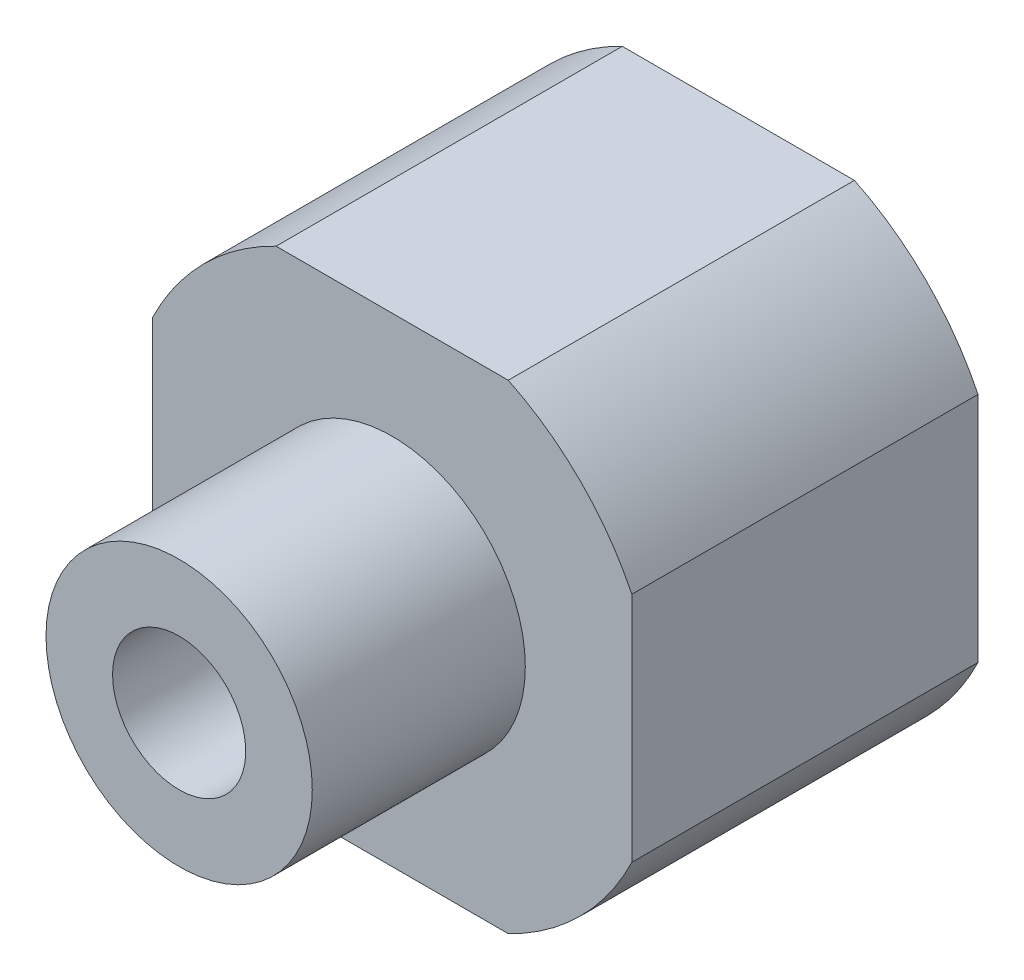
ISO-10303-21;
HEADER;
FILE_DESCRIPTION(('STEP AP214'),'2;1');
FILE_NAME('part.step','',(''),(''),'','','');
FILE_SCHEMA(('AUTOMOTIVE_DESIGN { 1 0 10303 214 1 1 1 1 }'));
ENDSEC;
DATA;
#1=APPLICATION_CONTEXT('core data for automotive mechanical design processes');
#2=APPLICATION_PROTOCOL_DEFINITION('international standard','automotive_design',2000,#1);
#3=PRODUCT_CONTEXT('',#1,'mechanical');
#4=PRODUCT('Part','Part','',(#3));
#5=PRODUCT_RELATED_PRODUCT_CATEGORY('part','',(#4));
#6=PRODUCT_DEFINITION_FORMATION('','',#4);
#7=PRODUCT_DEFINITION_CONTEXT('part definition',#1,'design');
#8=PRODUCT_DEFINITION('design','',#6,#7);
#9=PRODUCT_DEFINITION_SHAPE('','',#8);
#10=(LENGTH_UNIT() NAMED_UNIT(*) SI_UNIT(.MILLI.,.METRE.));
#11=(NAMED_UNIT(*) PLANE_ANGLE_UNIT() SI_UNIT($,.RADIAN.));
#12=(NAMED_UNIT(*) SI_UNIT($,.STERADIAN.) SOLID_ANGLE_UNIT());
#13=UNCERTAINTY_MEASURE_WITH_UNIT(LENGTH_MEASURE(1.E-05),#10,'distance_accuracy_value','');
#14=(GEOMETRIC_REPRESENTATION_CONTEXT(3) GLOBAL_UNCERTAINTY_ASSIGNED_CONTEXT((#13)) GLOBAL_UNIT_ASSIGNED_CONTEXT((#10,
#11,#12)) REPRESENTATION_CONTEXT('',''));
#15=CARTESIAN_POINT('',(0.,0.,0.));
#16=DIRECTION('',(0.,0.,1.));
#17=DIRECTION('',(1.,0.,0.));
#18=AXIS2_PLACEMENT_3D('',#15,#16,#17);
#19=CARTESIAN_POINT('',(0.,0.,13.));
#20=DIRECTION('',(0.,0.,-1.));
#21=DIRECTION('',(-1.,0.,0.));
#22=AXIS2_PLACEMENT_3D('',#19,#20,#21);
#23=CYLINDRICAL_SURFACE('',#22,10.);
#24=CARTESIAN_POINT('',(0.,0.,0.));
#25=DIRECTION('',(0.,0.,1.));
#26=DIRECTION('',(1.,0.,0.));
#27=AXIS2_PLACEMENT_3D('',#24,#25,#26);
#28=CIRCLE('',#27,10.);
#29=CARTESIAN_POINT('',(9.,4.35889894354068,0.));
#30=VERTEX_POINT('',#29);
#31=CARTESIAN_POINT('',(4.35889894354067,9.,0.));
#32=VERTEX_POINT('',#31);
#33=EDGE_CURVE('E128',#30,#32,#28,.T.);
#34=ORIENTED_EDGE('',*,*,#33,.T.);
#35=DIRECTION('',(0.,0.,-1.));
#36=VECTOR('',#35,1.);
#37=CARTESIAN_POINT('',(4.35889894354067,9.,13.));
#38=LINE('',#37,#36);
#39=CARTESIAN_POINT('',(4.35889894354067,9.,13.));
#40=VERTEX_POINT('',#39);
#41=EDGE_CURVE('E11',#40,#32,#38,.T.);
#42=ORIENTED_EDGE('',*,*,#41,.F.);
#43=CARTESIAN_POINT('',(0.,0.,13.));
#44=DIRECTION('',(0.,0.,1.));
#45=DIRECTION('',(1.,0.,0.));
#46=AXIS2_PLACEMENT_3D('',#43,#44,#45);
#47=CIRCLE('',#46,10.);
#48=CARTESIAN_POINT('',(9.,4.35889894354068,13.));
#49=VERTEX_POINT('',#48);
#50=EDGE_CURVE('E143',#49,#40,#47,.T.);
#51=ORIENTED_EDGE('',*,*,#50,.F.);
#52=DIRECTION('',(0.,0.,-1.));
#53=VECTOR('',#52,1.);
#54=CARTESIAN_POINT('',(9.,4.35889894354068,13.));
#55=LINE('',#54,#53);
#56=EDGE_CURVE('E124',#49,#30,#55,.T.);
#57=ORIENTED_EDGE('',*,*,#56,.T.);
#58=EDGE_LOOP('',(#34,#42,#51,#57));
#59=FACE_BOUND('',#58,.T.);
#60=ADVANCED_FACE('F32',(#59),#23,.T.);
#61=CARTESIAN_POINT('',(-4.35889894354067,9.,13.));
#62=DIRECTION('',(0.,-1.,0.));
#63=DIRECTION('',(0.,0.,-1.));
#64=AXIS2_PLACEMENT_3D('',#61,#62,#63);
#65=PLANE('',#64);
#66=DIRECTION('',(-1.,0.,0.));
#67=VECTOR('',#66,1.);
#68=CARTESIAN_POINT('',(-4.35889894354067,9.,0.));
#69=LINE('',#68,#67);
#70=CARTESIAN_POINT('',(-4.35889894354067,9.,0.));
#71=VERTEX_POINT('',#70);
#72=EDGE_CURVE('E131',#32,#71,#69,.T.);
#73=ORIENTED_EDGE('',*,*,#72,.T.);
#74=DIRECTION('',(0.,0.,-1.));
#75=VECTOR('',#74,1.);
#76=CARTESIAN_POINT('',(-4.35889894354067,9.,13.));
#77=LINE('',#76,#75);
#78=CARTESIAN_POINT('',(-4.35889894354067,9.,13.));
#79=VERTEX_POINT('',#78);
#80=EDGE_CURVE('E40',#79,#71,#77,.T.);
#81=ORIENTED_EDGE('',*,*,#80,.F.);
#82=DIRECTION('',(-1.,0.,0.));
#83=VECTOR('',#82,1.);
#84=CARTESIAN_POINT('',(-4.35889894354067,9.,13.));
#85=LINE('',#84,#83);
#86=EDGE_CURVE('E91',#40,#79,#85,.T.);
#87=ORIENTED_EDGE('',*,*,#86,.F.);
#88=ORIENTED_EDGE('',*,*,#41,.T.);
#89=EDGE_LOOP('',(#73,#81,#87,#88));
#90=FACE_BOUND('',#89,.T.);
#91=ADVANCED_FACE('F209',(#90),#65,.F.);
#92=CARTESIAN_POINT('',(0.,0.,13.));
#93=DIRECTION('',(0.,0.,-1.));
#94=DIRECTION('',(-1.,0.,0.));
#95=AXIS2_PLACEMENT_3D('',#92,#93,#94);
#96=CYLINDRICAL_SURFACE('',#95,10.);
#97=CARTESIAN_POINT('',(0.,0.,0.));
#98=DIRECTION('',(0.,0.,1.));
#99=DIRECTION('',(1.,0.,0.));
#100=AXIS2_PLACEMENT_3D('',#97,#98,#99);
#101=CIRCLE('',#100,10.);
#102=CARTESIAN_POINT('',(-9.,4.35889894354067,0.));
#103=VERTEX_POINT('',#102);
#104=EDGE_CURVE('E134',#71,#103,#101,.T.);
#105=ORIENTED_EDGE('',*,*,#104,.T.);
#106=DIRECTION('',(0.,0.,-1.));
#107=VECTOR('',#106,1.);
#108=CARTESIAN_POINT('',(-9.,4.35889894354067,13.));
#109=LINE('',#108,#107);
#110=CARTESIAN_POINT('',(-9.,4.35889894354067,13.));
#111=VERTEX_POINT('',#110);
#112=EDGE_CURVE('E150',#111,#103,#109,.T.);
#113=ORIENTED_EDGE('',*,*,#112,.F.);
#114=CARTESIAN_POINT('',(0.,0.,13.));
#115=DIRECTION('',(0.,0.,1.));
#116=DIRECTION('',(1.,0.,0.));
#117=AXIS2_PLACEMENT_3D('',#114,#115,#116);
#118=CIRCLE('',#117,10.);
#119=EDGE_CURVE('E158',#79,#111,#118,.T.);
#120=ORIENTED_EDGE('',*,*,#119,.F.);
#121=ORIENTED_EDGE('',*,*,#80,.T.);
#122=EDGE_LOOP('',(#105,#113,#120,#121));
#123=FACE_BOUND('',#122,.T.);
#124=ADVANCED_FACE('F156',(#123),#96,.T.);
#125=CARTESIAN_POINT('',(-9.,4.35889894354067,13.));
#126=DIRECTION('',(1.,0.,0.));
#127=DIRECTION('',(0.,0.,-1.));
#128=AXIS2_PLACEMENT_3D('',#125,#126,#127);
#129=PLANE('',#128);
#130=DIRECTION('',(0.,-1.,0.));
#131=VECTOR('',#130,1.);
#132=CARTESIAN_POINT('',(-9.,4.35889894354067,0.));
#133=LINE('',#132,#131);
#134=CARTESIAN_POINT('',(-9.,-4.35889894354067,0.));
#135=VERTEX_POINT('',#134);
#136=EDGE_CURVE('E136',#103,#135,#133,.T.);
#137=ORIENTED_EDGE('',*,*,#136,.T.);
#138=DIRECTION('',(0.,0.,-1.));
#139=VECTOR('',#138,1.);
#140=CARTESIAN_POINT('',(-9.,-4.35889894354067,13.));
#141=LINE('',#140,#139);
#142=CARTESIAN_POINT('',(-9.,-4.35889894354067,13.));
#143=VERTEX_POINT('',#142);
#144=EDGE_CURVE('E147',#143,#135,#141,.T.);
#145=ORIENTED_EDGE('',*,*,#144,.F.);
#146=DIRECTION('',(0.,-1.,0.));
#147=VECTOR('',#146,1.);
#148=CARTESIAN_POINT('',(-9.,4.35889894354067,13.));
#149=LINE('',#148,#147);
#150=EDGE_CURVE('E170',#111,#143,#149,.T.);
#151=ORIENTED_EDGE('',*,*,#150,.F.);
#152=ORIENTED_EDGE('',*,*,#112,.T.);
#153=EDGE_LOOP('',(#137,#145,#151,#152));
#154=FACE_BOUND('',#153,.T.);
#155=ADVANCED_FACE('F166',(#154),#129,.F.);
#156=CARTESIAN_POINT('',(0.,0.,13.));
#157=DIRECTION('',(0.,0.,-1.));
#158=DIRECTION('',(-1.,0.,0.));
#159=AXIS2_PLACEMENT_3D('',#156,#157,#158);
#160=CYLINDRICAL_SURFACE('',#159,10.);
#161=CARTESIAN_POINT('',(0.,0.,0.));
#162=DIRECTION('',(0.,0.,1.));
#163=DIRECTION('',(1.,0.,0.));
#164=AXIS2_PLACEMENT_3D('',#161,#162,#163);
#165=CIRCLE('',#164,10.);
#166=CARTESIAN_POINT('',(-4.35889894354068,-9.,0.));
#167=VERTEX_POINT('',#166);
#168=EDGE_CURVE('E138',#135,#167,#165,.T.);
#169=ORIENTED_EDGE('',*,*,#168,.T.);
#170=DIRECTION('',(0.,0.,-1.));
#171=VECTOR('',#170,1.);
#172=CARTESIAN_POINT('',(-4.35889894354068,-9.,13.));
#173=LINE('',#172,#171);
#174=CARTESIAN_POINT('',(-4.35889894354068,-9.,13.));
#175=VERTEX_POINT('',#174);
#176=EDGE_CURVE('E119',#175,#167,#173,.T.);
#177=ORIENTED_EDGE('',*,*,#176,.F.);
#178=CARTESIAN_POINT('',(0.,0.,13.));
#179=DIRECTION('',(0.,0.,1.));
#180=DIRECTION('',(1.,0.,0.));
#181=AXIS2_PLACEMENT_3D('',#178,#179,#180);
#182=CIRCLE('',#181,10.);
#183=EDGE_CURVE('E110',#143,#175,#182,.T.);
#184=ORIENTED_EDGE('',*,*,#183,.F.);
#185=ORIENTED_EDGE('',*,*,#144,.T.);
#186=EDGE_LOOP('',(#169,#177,#184,#185));
#187=FACE_BOUND('',#186,.T.);
#188=ADVANCED_FACE('F169',(#187),#160,.T.);
#189=CARTESIAN_POINT('',(-4.35889894354068,-9.,13.));
#190=DIRECTION('',(0.,1.,0.));
#191=DIRECTION('',(0.,0.,1.));
#192=AXIS2_PLACEMENT_3D('',#189,#190,#191);
#193=PLANE('',#192);
#194=DIRECTION('',(1.,0.,0.));
#195=VECTOR('',#194,1.);
#196=CARTESIAN_POINT('',(-4.35889894354068,-9.,0.));
#197=LINE('',#196,#195);
#198=CARTESIAN_POINT('',(4.35889894354068,-9.,0.));
#199=VERTEX_POINT('',#198);
#200=EDGE_CURVE('E118',#167,#199,#197,.T.);
#201=ORIENTED_EDGE('',*,*,#200,.T.);
#202=DIRECTION('',(0.,0.,-1.));
#203=VECTOR('',#202,1.);
#204=CARTESIAN_POINT('',(4.35889894354068,-9.,13.));
#205=LINE('',#204,#203);
#206=CARTESIAN_POINT('',(4.35889894354068,-9.,13.));
#207=VERTEX_POINT('',#206);
#208=EDGE_CURVE('E115',#207,#199,#205,.T.);
#209=ORIENTED_EDGE('',*,*,#208,.F.);
#210=DIRECTION('',(1.,0.,0.));
#211=VECTOR('',#210,1.);
#212=CARTESIAN_POINT('',(-4.35889894354068,-9.,13.));
#213=LINE('',#212,#211);
#214=EDGE_CURVE('E104',#175,#207,#213,.T.);
#215=ORIENTED_EDGE('',*,*,#214,.F.);
#216=ORIENTED_EDGE('',*,*,#176,.T.);
#217=EDGE_LOOP('',(#201,#209,#215,#216));
#218=FACE_BOUND('',#217,.T.);
#219=ADVANCED_FACE('F116',(#218),#193,.F.);
#220=CARTESIAN_POINT('',(0.,0.,13.));
#221=DIRECTION('',(0.,0.,-1.));
#222=DIRECTION('',(-1.,0.,0.));
#223=AXIS2_PLACEMENT_3D('',#220,#221,#222);
#224=CYLINDRICAL_SURFACE('',#223,10.);
#225=CARTESIAN_POINT('',(0.,0.,0.));
#226=DIRECTION('',(0.,0.,1.));
#227=DIRECTION('',(1.,0.,0.));
#228=AXIS2_PLACEMENT_3D('',#225,#226,#227);
#229=CIRCLE('',#228,10.);
#230=CARTESIAN_POINT('',(9.,-4.35889894354068,0.));
#231=VERTEX_POINT('',#230);
#232=EDGE_CURVE('E77',#199,#231,#229,.T.);
#233=ORIENTED_EDGE('',*,*,#232,.T.);
#234=DIRECTION('',(0.,0.,-1.));
#235=VECTOR('',#234,1.);
#236=CARTESIAN_POINT('',(9.,-4.35889894354068,13.));
#237=LINE('',#236,#235);
#238=CARTESIAN_POINT('',(9.,-4.35889894354068,13.));
#239=VERTEX_POINT('',#238);
#240=EDGE_CURVE('E120',#239,#231,#237,.T.);
#241=ORIENTED_EDGE('',*,*,#240,.F.);
#242=CARTESIAN_POINT('',(0.,0.,13.));
#243=DIRECTION('',(0.,0.,1.));
#244=DIRECTION('',(1.,0.,0.));
#245=AXIS2_PLACEMENT_3D('',#242,#243,#244);
#246=CIRCLE('',#245,10.);
#247=EDGE_CURVE('E108',#207,#239,#246,.T.);
#248=ORIENTED_EDGE('',*,*,#247,.F.);
#249=ORIENTED_EDGE('',*,*,#208,.T.);
#250=EDGE_LOOP('',(#233,#241,#248,#249));
#251=FACE_BOUND('',#250,.T.);
#252=ADVANCED_FACE('F122',(#251),#224,.T.);
#253=CARTESIAN_POINT('',(9.,4.35889894354068,13.));
#254=DIRECTION('',(-1.,0.,0.));
#255=DIRECTION('',(0.,0.,1.));
#256=AXIS2_PLACEMENT_3D('',#253,#254,#255);
#257=PLANE('',#256);
#258=DIRECTION('',(0.,1.,0.));
#259=VECTOR('',#258,1.);
#260=CARTESIAN_POINT('',(9.,4.35889894354068,0.));
#261=LINE('',#260,#259);
#262=EDGE_CURVE('E83',#231,#30,#261,.T.);
#263=ORIENTED_EDGE('',*,*,#262,.T.);
#264=ORIENTED_EDGE('',*,*,#56,.F.);
#265=DIRECTION('',(0.,1.,0.));
#266=VECTOR('',#265,1.);
#267=CARTESIAN_POINT('',(9.,4.35889894354068,13.));
#268=LINE('',#267,#266);
#269=EDGE_CURVE('E48',#239,#49,#268,.T.);
#270=ORIENTED_EDGE('',*,*,#269,.F.);
#271=ORIENTED_EDGE('',*,*,#240,.T.);
#272=EDGE_LOOP('',(#263,#264,#270,#271));
#273=FACE_BOUND('',#272,.T.);
#274=ADVANCED_FACE('F216',(#273),#257,.F.);
#275=CARTESIAN_POINT('',(0.,0.,13.));
#276=DIRECTION('',(0.,0.,1.));
#277=DIRECTION('',(1.,0.,0.));
#278=AXIS2_PLACEMENT_3D('',#275,#276,#277);
#279=PLANE('',#278);
#280=CARTESIAN_POINT('',(0.,0.,13.));
#281=DIRECTION('',(0.,0.,1.));
#282=DIRECTION('',(1.,0.,0.));
#283=AXIS2_PLACEMENT_3D('',#280,#281,#282);
#284=CIRCLE('',#283,5.);
#285=CARTESIAN_POINT('',(-5.,0.,13.));
#286=VERTEX_POINT('',#285);
#287=EDGE_CURVE('E132',#286,#286,#284,.F.);
#288=ORIENTED_EDGE('',*,*,#287,.T.);
#289=EDGE_LOOP('',(#288));
#290=FACE_BOUND('',#289,.T.);
#291=ORIENTED_EDGE('',*,*,#50,.T.);
#292=ORIENTED_EDGE('',*,*,#86,.T.);
#293=ORIENTED_EDGE('',*,*,#119,.T.);
#294=ORIENTED_EDGE('',*,*,#150,.T.);
#295=ORIENTED_EDGE('',*,*,#183,.T.);
#296=ORIENTED_EDGE('',*,*,#214,.T.);
#297=ORIENTED_EDGE('',*,*,#247,.T.);
#298=ORIENTED_EDGE('',*,*,#269,.T.);
#299=EDGE_LOOP('',(#291,#292,#293,#294,#295,#296,#297,#298));
#300=FACE_BOUND('',#299,.T.);
#301=ADVANCED_FACE('F106',(#290,#300),#279,.T.);
#302=CARTESIAN_POINT('',(0.,0.,0.));
#303=DIRECTION('',(0.,0.,1.));
#304=DIRECTION('',(1.,0.,0.));
#305=AXIS2_PLACEMENT_3D('',#302,#303,#304);
#306=PLANE('',#305);
#307=CARTESIAN_POINT('',(0.,0.,0.));
#308=DIRECTION('',(0.,0.,1.));
#309=DIRECTION('',(1.,0.,0.));
#310=AXIS2_PLACEMENT_3D('',#307,#308,#309);
#311=CIRCLE('',#310,2.5);
#312=CARTESIAN_POINT('',(-2.5,0.,0.));
#313=VERTEX_POINT('',#312);
#314=EDGE_CURVE('E182',#313,#313,#311,.T.);
#315=ORIENTED_EDGE('',*,*,#314,.T.);
#316=EDGE_LOOP('',(#315));
#317=FACE_BOUND('',#316,.T.);
#318=ORIENTED_EDGE('',*,*,#33,.F.);
#319=ORIENTED_EDGE('',*,*,#262,.F.);
#320=ORIENTED_EDGE('',*,*,#232,.F.);
#321=ORIENTED_EDGE('',*,*,#200,.F.);
#322=ORIENTED_EDGE('',*,*,#168,.F.);
#323=ORIENTED_EDGE('',*,*,#136,.F.);
#324=ORIENTED_EDGE('',*,*,#104,.F.);
#325=ORIENTED_EDGE('',*,*,#72,.F.);
#326=EDGE_LOOP('',(#318,#319,#320,#321,#322,#323,#324,#325));
#327=FACE_BOUND('',#326,.T.);
#328=ADVANCED_FACE('F162',(#317,#327),#306,.F.);
#329=CARTESIAN_POINT('',(0.,0.,21.));
#330=DIRECTION('',(0.,0.,-1.));
#331=DIRECTION('',(-1.,0.,0.));
#332=AXIS2_PLACEMENT_3D('',#329,#330,#331);
#333=CYLINDRICAL_SURFACE('',#332,5.);
#334=CARTESIAN_POINT('',(0.,0.,21.));
#335=DIRECTION('',(0.,0.,1.));
#336=DIRECTION('',(1.,0.,0.));
#337=AXIS2_PLACEMENT_3D('',#334,#335,#336);
#338=CIRCLE('',#337,5.);
#339=CARTESIAN_POINT('',(-5.,0.,21.));
#340=VERTEX_POINT('',#339);
#341=EDGE_CURVE('E178',#340,#340,#338,.T.);
#342=CARTESIAN_POINT('',(-5.,0.,13.));
#343=CARTESIAN_POINT('',(-5.,0.,13.0833333333333));
#344=CARTESIAN_POINT('',(-5.,0.,13.1666666666667));
#345=CARTESIAN_POINT('',(-5.,0.,13.3333333333333));
#346=CARTESIAN_POINT('',(-5.,0.,13.4166666666667));
#347=CARTESIAN_POINT('',(-5.,0.,13.5833333333333));
#348=CARTESIAN_POINT('',(-5.,0.,13.6666666666667));
#349=CARTESIAN_POINT('',(-5.,0.,13.8333333333333));
#350=CARTESIAN_POINT('',(-5.,0.,13.9166666666667));
#351=CARTESIAN_POINT('',(-5.,0.,14.0833333333333));
#352=CARTESIAN_POINT('',(-5.,0.,14.1666666666667));
#353=CARTESIAN_POINT('',(-5.,0.,14.3333333333333));
#354=CARTESIAN_POINT('',(-5.,0.,14.4166666666667));
#355=CARTESIAN_POINT('',(-5.,0.,14.5833333333333));
#356=CARTESIAN_POINT('',(-5.,0.,14.6666666666667));
#357=CARTESIAN_POINT('',(-5.,0.,14.8333333333333));
#358=CARTESIAN_POINT('',(-5.,0.,14.9166666666667));
#359=CARTESIAN_POINT('',(-5.,0.,15.0833333333333));
#360=CARTESIAN_POINT('',(-5.,0.,15.1666666666667));
#361=CARTESIAN_POINT('',(-5.,0.,15.3333333333333));
#362=CARTESIAN_POINT('',(-5.,0.,15.4166666666667));
#363=CARTESIAN_POINT('',(-5.,0.,15.5833333333333));
#364=CARTESIAN_POINT('',(-5.,0.,15.6666666666667));
#365=CARTESIAN_POINT('',(-5.,0.,15.8333333333333));
#366=CARTESIAN_POINT('',(-5.,0.,15.9166666666667));
#367=CARTESIAN_POINT('',(-5.,0.,16.0833333333333));
#368=CARTESIAN_POINT('',(-5.,0.,16.1666666666667));
#369=CARTESIAN_POINT('',(-5.,0.,16.3333333333333));
#370=CARTESIAN_POINT('',(-5.,0.,16.4166666666667));
#371=CARTESIAN_POINT('',(-5.,0.,16.5833333333333));
#372=CARTESIAN_POINT('',(-5.,0.,16.6666666666667));
#373=CARTESIAN_POINT('',(-5.,0.,16.8333333333333));
#374=CARTESIAN_POINT('',(-5.,0.,16.9166666666667));
#375=CARTESIAN_POINT('',(-5.,0.,17.0833333333333));
#376=CARTESIAN_POINT('',(-5.,0.,17.1666666666667));
#377=CARTESIAN_POINT('',(-5.,0.,17.3333333333333));
#378=CARTESIAN_POINT('',(-5.,0.,17.4166666666667));
#379=CARTESIAN_POINT('',(-5.,0.,17.5833333333333));
#380=CARTESIAN_POINT('',(-5.,0.,17.6666666666667));
#381=CARTESIAN_POINT('',(-5.,0.,17.8333333333333));
#382=CARTESIAN_POINT('',(-5.,0.,17.9166666666667));
#383=CARTESIAN_POINT('',(-5.,0.,18.0833333333333));
#384=CARTESIAN_POINT('',(-5.,0.,18.1666666666667));
#385=CARTESIAN_POINT('',(-5.,0.,18.3333333333333));
#386=CARTESIAN_POINT('',(-5.,0.,18.4166666666667));
#387=CARTESIAN_POINT('',(-5.,0.,18.5833333333333));
#388=CARTESIAN_POINT('',(-5.,0.,18.6666666666667));
#389=CARTESIAN_POINT('',(-5.,0.,18.8333333333333));
#390=CARTESIAN_POINT('',(-5.,0.,18.9166666666667));
#391=CARTESIAN_POINT('',(-5.,0.,19.0833333333333));
#392=CARTESIAN_POINT('',(-5.,0.,19.1666666666667));
#393=CARTESIAN_POINT('',(-5.,0.,19.3333333333333));
#394=CARTESIAN_POINT('',(-5.,0.,19.4166666666667));
#395=CARTESIAN_POINT('',(-5.,0.,19.5833333333333));
#396=CARTESIAN_POINT('',(-5.,0.,19.6666666666667));
#397=CARTESIAN_POINT('',(-5.,0.,19.8333333333333));
#398=CARTESIAN_POINT('',(-5.,0.,19.9166666666667));
#399=CARTESIAN_POINT('',(-5.,0.,20.0833333333333));
#400=CARTESIAN_POINT('',(-5.,0.,20.1666666666667));
#401=CARTESIAN_POINT('',(-5.,0.,20.3333333333333));
#402=CARTESIAN_POINT('',(-5.,0.,20.4166666666667));
#403=CARTESIAN_POINT('',(-5.,0.,20.5833333333333));
#404=CARTESIAN_POINT('',(-5.,0.,20.6666666666667));
#405=CARTESIAN_POINT('',(-5.,0.,20.8333333333333));
#406=CARTESIAN_POINT('',(-5.,0.,20.9166666666667));
#407=CARTESIAN_POINT('',(-5.,0.,21.));
#408=B_SPLINE_CURVE_WITH_KNOTS('',3,(#342,#343,#344,#345,#346,#347,#348,#349,#350,#351,#352,
#353,#354,#355,#356,#357,#358,#359,#360,#361,#362,#363,#364,#365,#366,#367,#368,#369,#370,#371,
#372,#373,#374,#375,#376,#377,#378,#379,#380,#381,#382,#383,#384,#385,#386,#387,#388,#389,#390,
#391,#392,#393,#394,#395,#396,#397,#398,#399,#400,#401,#402,#403,#404,#405,#406,#407),
.UNSPECIFIED.,.F.,.F.,(4,2,2,2,2,2,2,2,2,2,2,2,2,2,2,2,2,2,2,2,2,2,2,2,2,2,2,2,2,2,2,2,4),(0.,
0.249999999999999,0.499999999999999,0.749999999999999,0.999999999999999,1.25,1.5,1.75,2.,2.25,
2.5,2.75,3.,3.25,3.5,3.75,4.,4.25,4.5,4.75,5.,5.25,5.5,5.75,6.,6.25,6.5,6.75,7.,7.25,7.5,7.75,
8.),.UNSPECIFIED.);
#409=EDGE_CURVE('BSEAM194',#286,#340,#408,.T.);
#410=ORIENTED_EDGE('',*,*,#287,.F.);
#411=ORIENTED_EDGE('',*,*,#341,.F.);
#412=ORIENTED_EDGE('',*,*,#409,.T.);
#413=ORIENTED_EDGE('',*,*,#409,.F.);
#414=EDGE_LOOP('',(#410,#412,#411,#413));
#415=FACE_BOUND('',#414,.T.);
#416=ADVANCED_FACE('F194',(#415),#333,.T.);
#417=CARTESIAN_POINT('',(0.,0.,21.));
#418=DIRECTION('',(0.,0.,1.));
#419=DIRECTION('',(1.,0.,0.));
#420=AXIS2_PLACEMENT_3D('',#417,#418,#419);
#421=PLANE('',#420);
#422=CARTESIAN_POINT('',(0.,0.,21.));
#423=DIRECTION('',(0.,0.,1.));
#424=DIRECTION('',(1.,0.,0.));
#425=AXIS2_PLACEMENT_3D('',#422,#423,#424);
#426=CIRCLE('',#425,2.5);
#427=CARTESIAN_POINT('',(-2.5,0.,21.));
#428=VERTEX_POINT('',#427);
#429=EDGE_CURVE('E181',#428,#428,#426,.T.);
#430=ORIENTED_EDGE('',*,*,#429,.F.);
#431=EDGE_LOOP('',(#430));
#432=FACE_BOUND('',#431,.T.);
#433=ORIENTED_EDGE('',*,*,#341,.T.);
#434=EDGE_LOOP('',(#433));
#435=FACE_BOUND('',#434,.T.);
#436=ADVANCED_FACE('F191',(#432,#435),#421,.T.);
#437=CARTESIAN_POINT('',(0.,0.,21.));
#438=DIRECTION('',(0.,0.,-1.));
#439=DIRECTION('',(-1.,0.,0.));
#440=AXIS2_PLACEMENT_3D('',#437,#438,#439);
#441=CYLINDRICAL_SURFACE('',#440,2.5);
#442=CARTESIAN_POINT('',(-2.5,0.,21.));
#443=CARTESIAN_POINT('',(-2.5,0.,20.78125));
#444=CARTESIAN_POINT('',(-2.5,0.,20.5625));
#445=CARTESIAN_POINT('',(-2.5,0.,20.125));
#446=CARTESIAN_POINT('',(-2.5,0.,19.90625));
#447=CARTESIAN_POINT('',(-2.5,0.,19.46875));
#448=CARTESIAN_POINT('',(-2.5,0.,19.25));
#449=CARTESIAN_POINT('',(-2.5,0.,18.8125));
#450=CARTESIAN_POINT('',(-2.5,0.,18.59375));
#451=CARTESIAN_POINT('',(-2.5,0.,18.15625));
#452=CARTESIAN_POINT('',(-2.5,0.,17.9375));
#453=CARTESIAN_POINT('',(-2.5,0.,17.5));
#454=CARTESIAN_POINT('',(-2.5,0.,17.28125));
#455=CARTESIAN_POINT('',(-2.5,0.,16.84375));
#456=CARTESIAN_POINT('',(-2.5,0.,16.625));
#457=CARTESIAN_POINT('',(-2.5,0.,16.1875));
#458=CARTESIAN_POINT('',(-2.5,0.,15.96875));
#459=CARTESIAN_POINT('',(-2.5,0.,15.53125));
#460=CARTESIAN_POINT('',(-2.5,0.,15.3125));
#461=CARTESIAN_POINT('',(-2.5,0.,14.875));
#462=CARTESIAN_POINT('',(-2.5,0.,14.65625));
#463=CARTESIAN_POINT('',(-2.5,0.,14.21875));
#464=CARTESIAN_POINT('',(-2.5,0.,14.));
#465=CARTESIAN_POINT('',(-2.5,0.,13.5625));
#466=CARTESIAN_POINT('',(-2.5,0.,13.34375));
#467=CARTESIAN_POINT('',(-2.5,0.,12.90625));
#468=CARTESIAN_POINT('',(-2.5,0.,12.6875));
#469=CARTESIAN_POINT('',(-2.5,0.,12.25));
#470=CARTESIAN_POINT('',(-2.5,0.,12.03125));
#471=CARTESIAN_POINT('',(-2.5,0.,11.59375));
#472=CARTESIAN_POINT('',(-2.5,0.,11.375));
#473=CARTESIAN_POINT('',(-2.5,0.,10.9375));
#474=CARTESIAN_POINT('',(-2.5,0.,10.71875));
#475=CARTESIAN_POINT('',(-2.5,0.,10.28125));
#476=CARTESIAN_POINT('',(-2.5,0.,10.0625));
#477=CARTESIAN_POINT('',(-2.5,0.,9.625));
#478=CARTESIAN_POINT('',(-2.5,0.,9.40625));
#479=CARTESIAN_POINT('',(-2.5,0.,8.96875));
#480=CARTESIAN_POINT('',(-2.5,0.,8.75));
#481=CARTESIAN_POINT('',(-2.5,0.,8.3125));
#482=CARTESIAN_POINT('',(-2.5,0.,8.09375));
#483=CARTESIAN_POINT('',(-2.5,0.,7.65625));
#484=CARTESIAN_POINT('',(-2.5,0.,7.4375));
#485=CARTESIAN_POINT('',(-2.5,0.,7.));
#486=CARTESIAN_POINT('',(-2.5,0.,6.78125));
#487=CARTESIAN_POINT('',(-2.5,0.,6.34375));
#488=CARTESIAN_POINT('',(-2.5,0.,6.125));
#489=CARTESIAN_POINT('',(-2.5,0.,5.6875));
#490=CARTESIAN_POINT('',(-2.5,0.,5.46875));
#491=CARTESIAN_POINT('',(-2.5,0.,5.03125));
#492=CARTESIAN_POINT('',(-2.5,0.,4.8125));
#493=CARTESIAN_POINT('',(-2.5,0.,4.375));
#494=CARTESIAN_POINT('',(-2.5,0.,4.15625));
#495=CARTESIAN_POINT('',(-2.5,0.,3.71875));
#496=CARTESIAN_POINT('',(-2.5,0.,3.5));
#497=CARTESIAN_POINT('',(-2.5,0.,3.0625));
#498=CARTESIAN_POINT('',(-2.5,0.,2.84375));
#499=CARTESIAN_POINT('',(-2.5,0.,2.40625));
#500=CARTESIAN_POINT('',(-2.5,0.,2.1875));
#501=CARTESIAN_POINT('',(-2.5,0.,1.75));
#502=CARTESIAN_POINT('',(-2.5,0.,1.53125));
#503=CARTESIAN_POINT('',(-2.5,0.,1.09375));
#504=CARTESIAN_POINT('',(-2.5,0.,0.875000000000001));
#505=CARTESIAN_POINT('',(-2.5,0.,0.4375));
#506=CARTESIAN_POINT('',(-2.5,0.,0.21875));
#507=CARTESIAN_POINT('',(-2.5,0.,0.));
#508=B_SPLINE_CURVE_WITH_KNOTS('',3,(#442,#443,#444,#445,#446,#447,#448,#449,#450,#451,#452,
#453,#454,#455,#456,#457,#458,#459,#460,#461,#462,#463,#464,#465,#466,#467,#468,#469,#470,#471,
#472,#473,#474,#475,#476,#477,#478,#479,#480,#481,#482,#483,#484,#485,#486,#487,#488,#489,#490,
#491,#492,#493,#494,#495,#496,#497,#498,#499,#500,#501,#502,#503,#504,#505,#506,#507),
.UNSPECIFIED.,.F.,.F.,(4,2,2,2,2,2,2,2,2,2,2,2,2,2,2,2,2,2,2,2,2,2,2,2,2,2,2,2,2,2,2,2,4),(0.,
0.656250000000001,1.3125,1.96875,2.625,3.28125,3.9375,4.59375,5.25,5.90625,6.5625,7.21875,7.875,
8.53125,9.1875,9.84375,10.5,11.15625,11.8125,12.46875,13.125,13.78125,14.4375,15.09375,15.75,
16.40625,17.0625,17.71875,18.375,19.03125,19.6875,20.34375,21.),.UNSPECIFIED.);
#509=EDGE_CURVE('BSEAM188',#428,#313,#508,.T.);
#510=ORIENTED_EDGE('',*,*,#429,.T.);
#511=ORIENTED_EDGE('',*,*,#314,.F.);
#512=ORIENTED_EDGE('',*,*,#509,.T.);
#513=ORIENTED_EDGE('',*,*,#509,.F.);
#514=EDGE_LOOP('',(#510,#512,#511,#513));
#515=FACE_BOUND('',#514,.T.);
#516=ADVANCED_FACE('F188',(#515),#441,.F.);
#517=CLOSED_SHELL('',(#60,#91,#124,#155,#188,#219,#252,#274,#301,#328,#416,#436,#516));
#518=MANIFOLD_SOLID_BREP('B2',#517);
#519=ADVANCED_BREP_SHAPE_REPRESENTATION('',(#18,#518),#14);
#520=SHAPE_DEFINITION_REPRESENTATION(#9,#519);
ENDSEC;
END-ISO-10303-21;
